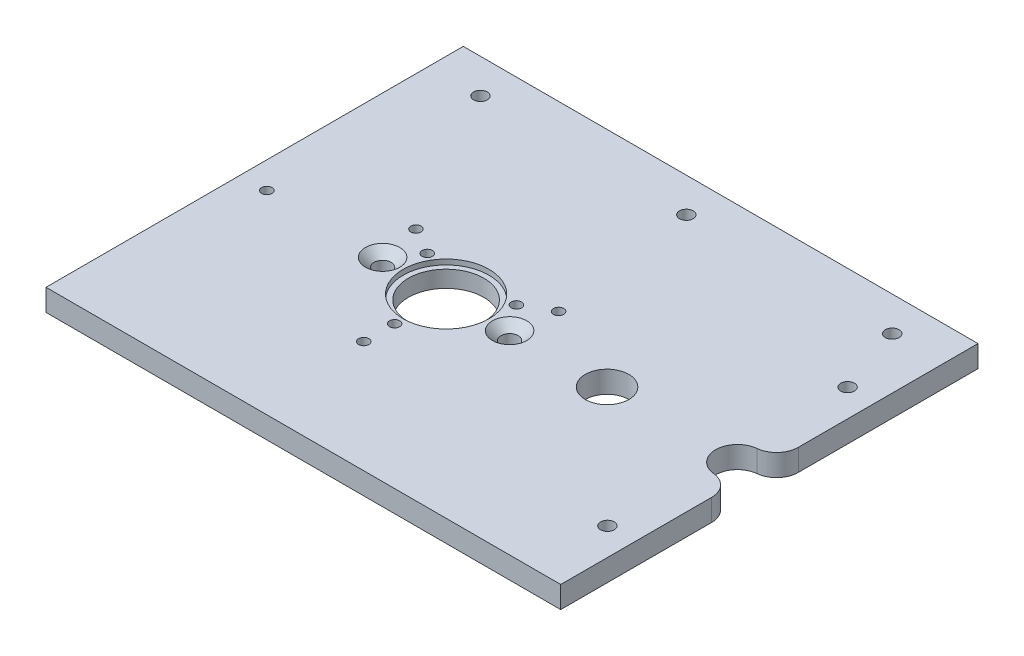
ISO-10303-21;
HEADER;
FILE_DESCRIPTION(('STEP AP214'),'2;1');
FILE_NAME('part.step','',(''),(''),'','','');
FILE_SCHEMA(('AUTOMOTIVE_DESIGN { 1 0 10303 214 1 1 1 1 }'));
ENDSEC;
DATA;
#1=APPLICATION_CONTEXT('core data for automotive mechanical design processes');
#2=APPLICATION_PROTOCOL_DEFINITION('international standard','automotive_design',2000,#1);
#3=PRODUCT_CONTEXT('',#1,'mechanical');
#4=PRODUCT('Part','Part','',(#3));
#5=PRODUCT_RELATED_PRODUCT_CATEGORY('part','',(#4));
#6=PRODUCT_DEFINITION_FORMATION('','',#4);
#7=PRODUCT_DEFINITION_CONTEXT('part definition',#1,'design');
#8=PRODUCT_DEFINITION('design','',#6,#7);
#9=PRODUCT_DEFINITION_SHAPE('','',#8);
#10=(LENGTH_UNIT() NAMED_UNIT(*) SI_UNIT(.MILLI.,.METRE.));
#11=(NAMED_UNIT(*) PLANE_ANGLE_UNIT() SI_UNIT($,.RADIAN.));
#12=(NAMED_UNIT(*) SI_UNIT($,.STERADIAN.) SOLID_ANGLE_UNIT());
#13=UNCERTAINTY_MEASURE_WITH_UNIT(LENGTH_MEASURE(1.E-05),#10,'distance_accuracy_value','');
#14=(GEOMETRIC_REPRESENTATION_CONTEXT(3) GLOBAL_UNCERTAINTY_ASSIGNED_CONTEXT((#13)) GLOBAL_UNIT_ASSIGNED_CONTEXT((#10,
#11,#12)) REPRESENTATION_CONTEXT('',''));
#15=CARTESIAN_POINT('',(0.,0.,0.));
#16=DIRECTION('',(0.,0.,1.));
#17=DIRECTION('',(1.,0.,0.));
#18=AXIS2_PLACEMENT_3D('',#15,#16,#17);
#19=CARTESIAN_POINT('',(-15.,-3.175,-5.80000000000001));
#20=DIRECTION('',(0.,1.,0.));
#21=DIRECTION('',(0.,0.,1.));
#22=AXIS2_PLACEMENT_3D('',#19,#20,#21);
#23=CYLINDRICAL_SURFACE('',#22,11.);
#24=CARTESIAN_POINT('',(-15.,-3.175,-5.80000000000001));
#25=DIRECTION('',(0.,1.,0.));
#26=DIRECTION('',(0.,0.,1.));
#27=AXIS2_PLACEMENT_3D('',#24,#25,#26);
#28=CIRCLE('',#27,11.);
#29=CARTESIAN_POINT('',(-15.,-3.175,5.19999999999999));
#30=VERTEX_POINT('',#29);
#31=EDGE_CURVE('E213',#30,#30,#28,.T.);
#32=ORIENTED_EDGE('',*,*,#31,.F.);
#33=EDGE_LOOP('',(#32));
#34=FACE_BOUND('',#33,.T.);
#35=CARTESIAN_POINT('',(-15.,1.675,-5.80000000000001));
#36=DIRECTION('',(0.,1.,0.));
#37=DIRECTION('',(0.,0.,1.));
#38=AXIS2_PLACEMENT_3D('',#35,#36,#37);
#39=CIRCLE('',#38,11.);
#40=CARTESIAN_POINT('',(-15.,1.675,5.19999999999999));
#41=VERTEX_POINT('',#40);
#42=EDGE_CURVE('E161',#41,#41,#39,.F.);
#43=ORIENTED_EDGE('',*,*,#42,.F.);
#44=EDGE_LOOP('',(#43));
#45=FACE_BOUND('',#44,.T.);
#46=ADVANCED_FACE('F41',(#34,#45),#23,.F.);
#47=CARTESIAN_POINT('',(75.,3.175,-50.8));
#48=DIRECTION('',(-1.,0.,0.));
#49=DIRECTION('',(0.,0.,1.));
#50=AXIS2_PLACEMENT_3D('',#47,#48,#49);
#51=PLANE('',#50);
#52=DIRECTION('',(0.,0.,-1.));
#53=VECTOR('',#52,1.);
#54=CARTESIAN_POINT('',(75.,-3.175,-50.8));
#55=LINE('',#54,#53);
#56=CARTESIAN_POINT('',(75.,-3.175,50.8));
#57=VERTEX_POINT('',#56);
#58=CARTESIAN_POINT('',(75.,-3.175,6.8383345421776));
#59=VERTEX_POINT('',#58);
#60=EDGE_CURVE('E234',#57,#59,#55,.T.);
#61=ORIENTED_EDGE('',*,*,#60,.T.);
#62=DIRECTION('',(0.,1.,0.));
#63=VECTOR('',#62,1.);
#64=CARTESIAN_POINT('',(75.,3.175,6.8383345421776));
#65=LINE('',#64,#63);
#66=CARTESIAN_POINT('',(75.,3.175,6.8383345421776));
#67=VERTEX_POINT('',#66);
#68=EDGE_CURVE('E247',#59,#67,#65,.T.);
#69=ORIENTED_EDGE('',*,*,#68,.T.);
#70=DIRECTION('',(0.,0.,-1.));
#71=VECTOR('',#70,1.);
#72=CARTESIAN_POINT('',(75.,3.175,-50.8));
#73=LINE('',#72,#71);
#74=CARTESIAN_POINT('',(75.,3.175,50.8));
#75=VERTEX_POINT('',#74);
#76=EDGE_CURVE('E121',#75,#67,#73,.T.);
#77=ORIENTED_EDGE('',*,*,#76,.F.);
#78=DIRECTION('',(0.,-1.,0.));
#79=VECTOR('',#78,1.);
#80=CARTESIAN_POINT('',(75.,3.175,50.8));
#81=LINE('',#80,#79);
#82=EDGE_CURVE('E233',#75,#57,#81,.T.);
#83=ORIENTED_EDGE('',*,*,#82,.T.);
#84=EDGE_LOOP('',(#61,#69,#77,#83));
#85=FACE_BOUND('',#84,.T.);
#86=ADVANCED_FACE('F353',(#85),#51,.F.);
#87=CARTESIAN_POINT('',(75.,3.175,-18.4383345421776));
#88=VERTEX_POINT('',#87);
#89=CARTESIAN_POINT('',(75.,3.175,-70.8));
#90=VERTEX_POINT('',#89);
#91=EDGE_CURVE('E110',#88,#90,#73,.T.);
#92=ORIENTED_EDGE('',*,*,#91,.F.);
#93=DIRECTION('',(0.,1.,0.));
#94=VECTOR('',#93,1.);
#95=CARTESIAN_POINT('',(75.,3.175,-18.4383345421776));
#96=LINE('',#95,#94);
#97=CARTESIAN_POINT('',(75.,-3.175,-18.4383345421776));
#98=VERTEX_POINT('',#97);
#99=EDGE_CURVE('E259',#88,#98,#96,.F.);
#100=ORIENTED_EDGE('',*,*,#99,.T.);
#101=CARTESIAN_POINT('',(75.,-3.17500000000001,-70.8));
#102=VERTEX_POINT('',#101);
#103=EDGE_CURVE('E128',#98,#102,#55,.T.);
#104=ORIENTED_EDGE('',*,*,#103,.T.);
#105=DIRECTION('',(0.,1.,0.));
#106=VECTOR('',#105,1.);
#107=CARTESIAN_POINT('',(75.,-154.502459504216,-70.8));
#108=LINE('',#107,#106);
#109=EDGE_CURVE('E125',#102,#90,#108,.T.);
#110=ORIENTED_EDGE('',*,*,#109,.T.);
#111=EDGE_LOOP('',(#92,#100,#104,#110));
#112=FACE_BOUND('',#111,.T.);
#113=ADVANCED_FACE('F126',(#112),#51,.F.);
#114=CARTESIAN_POINT('',(-75.,3.175,-50.8));
#115=DIRECTION('',(1.,0.,0.));
#116=DIRECTION('',(0.,0.,-1.));
#117=AXIS2_PLACEMENT_3D('',#114,#115,#116);
#118=PLANE('',#117);
#119=DIRECTION('',(0.,0.,1.));
#120=VECTOR('',#119,1.);
#121=CARTESIAN_POINT('',(-75.,-3.175,-50.8));
#122=LINE('',#121,#120);
#123=CARTESIAN_POINT('',(-75.,-3.17500000000001,-70.8));
#124=VERTEX_POINT('',#123);
#125=CARTESIAN_POINT('',(-75.,-3.175,50.8));
#126=VERTEX_POINT('',#125);
#127=EDGE_CURVE('E237',#124,#126,#122,.T.);
#128=ORIENTED_EDGE('',*,*,#127,.T.);
#129=DIRECTION('',(0.,-1.,0.));
#130=VECTOR('',#129,1.);
#131=CARTESIAN_POINT('',(-75.,3.175,50.8));
#132=LINE('',#131,#130);
#133=CARTESIAN_POINT('',(-75.,3.175,50.8));
#134=VERTEX_POINT('',#133);
#135=EDGE_CURVE('E242',#134,#126,#132,.T.);
#136=ORIENTED_EDGE('',*,*,#135,.F.);
#137=DIRECTION('',(0.,0.,1.));
#138=VECTOR('',#137,1.);
#139=CARTESIAN_POINT('',(-75.,3.175,-50.8));
#140=LINE('',#139,#138);
#141=CARTESIAN_POINT('',(-75.,3.175,-70.8));
#142=VERTEX_POINT('',#141);
#143=EDGE_CURVE('E229',#142,#134,#140,.T.);
#144=ORIENTED_EDGE('',*,*,#143,.F.);
#145=DIRECTION('',(0.,1.,0.));
#146=VECTOR('',#145,1.);
#147=CARTESIAN_POINT('',(-75.,-154.502459504216,-70.8));
#148=LINE('',#147,#146);
#149=EDGE_CURVE('E132',#124,#142,#148,.T.);
#150=ORIENTED_EDGE('',*,*,#149,.F.);
#151=EDGE_LOOP('',(#128,#136,#144,#150));
#152=FACE_BOUND('',#151,.T.);
#153=ADVANCED_FACE('F370',(#152),#118,.F.);
#154=CARTESIAN_POINT('',(-75.,3.175,50.8));
#155=DIRECTION('',(0.,0.,-1.));
#156=DIRECTION('',(-1.,0.,0.));
#157=AXIS2_PLACEMENT_3D('',#154,#155,#156);
#158=PLANE('',#157);
#159=DIRECTION('',(1.,0.,0.));
#160=VECTOR('',#159,1.);
#161=CARTESIAN_POINT('',(-75.,-3.175,50.8));
#162=LINE('',#161,#160);
#163=EDGE_CURVE('E122',#126,#57,#162,.T.);
#164=ORIENTED_EDGE('',*,*,#163,.T.);
#165=ORIENTED_EDGE('',*,*,#82,.F.);
#166=DIRECTION('',(1.,0.,0.));
#167=VECTOR('',#166,1.);
#168=CARTESIAN_POINT('',(-75.,3.175,50.8));
#169=LINE('',#168,#167);
#170=EDGE_CURVE('E231',#134,#75,#169,.T.);
#171=ORIENTED_EDGE('',*,*,#170,.F.);
#172=ORIENTED_EDGE('',*,*,#135,.T.);
#173=EDGE_LOOP('',(#164,#165,#171,#172));
#174=FACE_BOUND('',#173,.T.);
#175=ADVANCED_FACE('F337',(#174),#158,.F.);
#176=CARTESIAN_POINT('',(0.,3.175,0.));
#177=DIRECTION('',(0.,1.,0.));
#178=DIRECTION('',(0.,0.,1.));
#179=AXIS2_PLACEMENT_3D('',#176,#177,#178);
#180=PLANE('',#179);
#181=CARTESIAN_POINT('',(-33.5,3.175,-5.80000000000001));
#182=DIRECTION('',(0.,1.,0.));
#183=DIRECTION('',(0.,0.,1.));
#184=AXIS2_PLACEMENT_3D('',#181,#182,#183);
#185=CIRCLE('',#184,5.);
#186=CARTESIAN_POINT('',(-33.5,3.175,-0.800000000000009));
#187=VERTEX_POINT('',#186);
#188=EDGE_CURVE('E50',#187,#187,#185,.F.);
#189=ORIENTED_EDGE('',*,*,#188,.T.);
#190=EDGE_LOOP('',(#189));
#191=FACE_BOUND('',#190,.T.);
#192=CARTESIAN_POINT('',(3.5,3.175,-5.80000000000001));
#193=DIRECTION('',(0.,1.,0.));
#194=DIRECTION('',(0.,0.,1.));
#195=AXIS2_PLACEMENT_3D('',#192,#193,#194);
#196=CIRCLE('',#195,5.);
#197=CARTESIAN_POINT('',(3.5,3.175,-0.800000000000009));
#198=VERTEX_POINT('',#197);
#199=EDGE_CURVE('E266',#198,#198,#196,.F.);
#200=ORIENTED_EDGE('',*,*,#199,.T.);
#201=EDGE_LOOP('',(#200));
#202=FACE_BOUND('',#201,.T.);
#203=CARTESIAN_POINT('',(-15.,3.175,-5.80000000000001));
#204=DIRECTION('',(0.,1.,0.));
#205=DIRECTION('',(0.,0.,1.));
#206=AXIS2_PLACEMENT_3D('',#203,#204,#205);
#207=CIRCLE('',#206,12.5);
#208=CARTESIAN_POINT('',(-15.,3.175,6.69999999999999));
#209=VERTEX_POINT('',#208);
#210=EDGE_CURVE('E154',#209,#209,#207,.T.);
#211=ORIENTED_EDGE('',*,*,#210,.F.);
#212=EDGE_LOOP('',(#211));
#213=FACE_BOUND('',#212,.T.);
#214=CARTESIAN_POINT('',(5.78460969082654,3.175,-17.8));
#215=DIRECTION('',(0.,1.,0.));
#216=DIRECTION('',(0.,0.,1.));
#217=AXIS2_PLACEMENT_3D('',#214,#215,#216);
#218=CIRCLE('',#217,1.5);
#219=CARTESIAN_POINT('',(5.78460969082654,3.175,-16.3));
#220=VERTEX_POINT('',#219);
#221=EDGE_CURVE('E177',#220,#220,#218,.T.);
#222=ORIENTED_EDGE('',*,*,#221,.F.);
#223=EDGE_LOOP('',(#222));
#224=FACE_BOUND('',#223,.T.);
#225=CARTESIAN_POINT('',(-15.,3.175,18.2));
#226=DIRECTION('',(0.,1.,0.));
#227=DIRECTION('',(0.,0.,1.));
#228=AXIS2_PLACEMENT_3D('',#225,#226,#227);
#229=CIRCLE('',#228,1.5);
#230=CARTESIAN_POINT('',(-15.,3.175,19.7));
#231=VERTEX_POINT('',#230);
#232=EDGE_CURVE('E178',#231,#231,#229,.T.);
#233=ORIENTED_EDGE('',*,*,#232,.F.);
#234=EDGE_LOOP('',(#233));
#235=FACE_BOUND('',#234,.T.);
#236=CARTESIAN_POINT('',(-27.9903810567666,3.175,-13.3));
#237=DIRECTION('',(0.,1.,0.));
#238=DIRECTION('',(0.,0.,1.));
#239=AXIS2_PLACEMENT_3D('',#236,#237,#238);
#240=CIRCLE('',#239,1.5);
#241=CARTESIAN_POINT('',(-27.9903810567666,3.175,-11.8));
#242=VERTEX_POINT('',#241);
#243=EDGE_CURVE('E185',#242,#242,#240,.T.);
#244=ORIENTED_EDGE('',*,*,#243,.F.);
#245=EDGE_LOOP('',(#244));
#246=FACE_BOUND('',#245,.T.);
#247=CARTESIAN_POINT('',(-35.7846096908265,3.175,-17.8));
#248=DIRECTION('',(0.,1.,0.));
#249=DIRECTION('',(0.,0.,1.));
#250=AXIS2_PLACEMENT_3D('',#247,#248,#249);
#251=CIRCLE('',#250,1.5);
#252=CARTESIAN_POINT('',(-35.7846096908265,3.175,-16.3));
#253=VERTEX_POINT('',#252);
#254=EDGE_CURVE('E164',#253,#253,#251,.T.);
#255=ORIENTED_EDGE('',*,*,#254,.F.);
#256=EDGE_LOOP('',(#255));
#257=FACE_BOUND('',#256,.T.);
#258=CARTESIAN_POINT('',(-2.00961894323341,3.175,-13.3));
#259=DIRECTION('',(0.,1.,0.));
#260=DIRECTION('',(0.,0.,1.));
#261=AXIS2_PLACEMENT_3D('',#258,#259,#260);
#262=CIRCLE('',#261,1.5);
#263=CARTESIAN_POINT('',(-2.00961894323341,3.175,-11.8));
#264=VERTEX_POINT('',#263);
#265=EDGE_CURVE('E171',#264,#264,#262,.T.);
#266=ORIENTED_EDGE('',*,*,#265,.F.);
#267=EDGE_LOOP('',(#266));
#268=FACE_BOUND('',#267,.T.);
#269=CARTESIAN_POINT('',(-15.,3.175,9.19999999999999));
#270=DIRECTION('',(0.,1.,0.));
#271=DIRECTION('',(0.,0.,1.));
#272=AXIS2_PLACEMENT_3D('',#269,#270,#271);
#273=CIRCLE('',#272,1.5);
#274=CARTESIAN_POINT('',(-15.,3.175,10.7));
#275=VERTEX_POINT('',#274);
#276=EDGE_CURVE('E181',#275,#275,#273,.T.);
#277=ORIENTED_EDGE('',*,*,#276,.F.);
#278=EDGE_LOOP('',(#277));
#279=FACE_BOUND('',#278,.T.);
#280=CARTESIAN_POINT('',(67.,3.175,-40.8));
#281=DIRECTION('',(0.,1.,0.));
#282=DIRECTION('',(0.,0.,1.));
#283=AXIS2_PLACEMENT_3D('',#280,#281,#282);
#284=CIRCLE('',#283,2.);
#285=CARTESIAN_POINT('',(67.,3.175,-38.8));
#286=VERTEX_POINT('',#285);
#287=EDGE_CURVE('E204',#286,#286,#284,.T.);
#288=ORIENTED_EDGE('',*,*,#287,.F.);
#289=EDGE_LOOP('',(#288));
#290=FACE_BOUND('',#289,.T.);
#291=ORIENTED_EDGE('',*,*,#76,.T.);
#292=CARTESIAN_POINT('',(68.65,3.175,6.8383345421776));
#293=DIRECTION('',(0.,1.,0.));
#294=DIRECTION('',(0.,0.,1.));
#295=AXIS2_PLACEMENT_3D('',#292,#293,#294);
#296=CIRCLE('',#295,6.35);
#297=CARTESIAN_POINT('',(69.275,3.175,0.519167271088791));
#298=VERTEX_POINT('',#297);
#299=EDGE_CURVE('E251',#67,#298,#296,.T.);
#300=ORIENTED_EDGE('',*,*,#299,.T.);
#301=CARTESIAN_POINT('',(69.9,3.175,-5.80000000000001));
#302=DIRECTION('',(0.,1.,0.));
#303=DIRECTION('',(0.,0.,1.));
#304=AXIS2_PLACEMENT_3D('',#301,#302,#303);
#305=CIRCLE('',#304,6.35);
#306=CARTESIAN_POINT('',(69.275,3.175,-12.1191672710888));
#307=VERTEX_POINT('',#306);
#308=EDGE_CURVE('E198',#307,#298,#305,.T.);
#309=ORIENTED_EDGE('',*,*,#308,.F.);
#310=CARTESIAN_POINT('',(68.65,3.175,-18.4383345421776));
#311=DIRECTION('',(0.,1.,0.));
#312=DIRECTION('',(0.,0.,1.));
#313=AXIS2_PLACEMENT_3D('',#310,#311,#312);
#314=CIRCLE('',#313,6.35);
#315=EDGE_CURVE('E119',#307,#88,#314,.T.);
#316=ORIENTED_EDGE('',*,*,#315,.T.);
#317=ORIENTED_EDGE('',*,*,#91,.T.);
#318=DIRECTION('',(-1.,0.,0.));
#319=VECTOR('',#318,1.);
#320=CARTESIAN_POINT('',(-75.,3.175,-70.8));
#321=LINE('',#320,#319);
#322=EDGE_CURVE('E116',#90,#142,#321,.T.);
#323=ORIENTED_EDGE('',*,*,#322,.T.);
#324=ORIENTED_EDGE('',*,*,#143,.T.);
#325=ORIENTED_EDGE('',*,*,#170,.T.);
#326=EDGE_LOOP('',(#291,#300,#309,#316,#317,#323,#324,#325));
#327=FACE_BOUND('',#326,.T.);
#328=CARTESIAN_POINT('',(67.,3.175,29.2));
#329=DIRECTION('',(0.,1.,0.));
#330=DIRECTION('',(0.,0.,-1.));
#331=AXIS2_PLACEMENT_3D('',#328,#329,#330);
#332=CIRCLE('',#331,2.);
#333=CARTESIAN_POINT('',(67.,3.175,27.2));
#334=VERTEX_POINT('',#333);
#335=EDGE_CURVE('E207',#334,#334,#332,.T.);
#336=ORIENTED_EDGE('',*,*,#335,.F.);
#337=EDGE_LOOP('',(#336));
#338=FACE_BOUND('',#337,.T.);
#339=CARTESIAN_POINT('',(-67.25,3.175,-5.80000000000001));
#340=DIRECTION('',(0.,1.,0.));
#341=DIRECTION('',(0.,0.,1.));
#342=AXIS2_PLACEMENT_3D('',#339,#340,#341);
#343=CIRCLE('',#342,1.5);
#344=CARTESIAN_POINT('',(-67.25,3.175,-4.30000000000002));
#345=VERTEX_POINT('',#344);
#346=EDGE_CURVE('E210',#345,#345,#343,.T.);
#347=ORIENTED_EDGE('',*,*,#346,.F.);
#348=EDGE_LOOP('',(#347));
#349=FACE_BOUND('',#348,.T.);
#350=CARTESIAN_POINT('',(31.9,3.175,-5.80000000000001));
#351=DIRECTION('',(0.,1.,0.));
#352=DIRECTION('',(0.,0.,1.));
#353=AXIS2_PLACEMENT_3D('',#350,#351,#352);
#354=CIRCLE('',#353,6.35);
#355=CARTESIAN_POINT('',(31.9,3.175,0.549999999999989));
#356=VERTEX_POINT('',#355);
#357=EDGE_CURVE('E217',#356,#356,#354,.T.);
#358=ORIENTED_EDGE('',*,*,#357,.F.);
#359=EDGE_LOOP('',(#358));
#360=FACE_BOUND('',#359,.T.);
#361=CARTESIAN_POINT('',(60.,3.175,-60.8000000000002));
#362=DIRECTION('',(0.,1.,0.));
#363=DIRECTION('',(0.,0.,-1.));
#364=AXIS2_PLACEMENT_3D('',#361,#362,#363);
#365=CIRCLE('',#364,2.);
#366=CARTESIAN_POINT('',(60.,3.175,-62.8000000000002));
#367=VERTEX_POINT('',#366);
#368=EDGE_CURVE('E328',#367,#367,#365,.T.);
#369=ORIENTED_EDGE('',*,*,#368,.F.);
#370=EDGE_LOOP('',(#369));
#371=FACE_BOUND('',#370,.T.);
#372=CARTESIAN_POINT('',(-60.,3.175,-60.8));
#373=DIRECTION('',(0.,1.,0.));
#374=DIRECTION('',(0.,0.,1.));
#375=AXIS2_PLACEMENT_3D('',#372,#373,#374);
#376=CIRCLE('',#375,2.);
#377=CARTESIAN_POINT('',(-60.,3.175,-58.8));
#378=VERTEX_POINT('',#377);
#379=EDGE_CURVE('E140',#378,#378,#376,.T.);
#380=ORIENTED_EDGE('',*,*,#379,.F.);
#381=EDGE_LOOP('',(#380));
#382=FACE_BOUND('',#381,.T.);
#383=CARTESIAN_POINT('',(0.,3.175,-60.8));
#384=DIRECTION('',(0.,1.,0.));
#385=DIRECTION('',(0.,0.,1.));
#386=AXIS2_PLACEMENT_3D('',#383,#384,#385);
#387=CIRCLE('',#386,2.);
#388=CARTESIAN_POINT('',(0.,3.175,-58.8));
#389=VERTEX_POINT('',#388);
#390=EDGE_CURVE('E137',#389,#389,#387,.T.);
#391=ORIENTED_EDGE('',*,*,#390,.F.);
#392=EDGE_LOOP('',(#391));
#393=FACE_BOUND('',#392,.T.);
#394=ADVANCED_FACE('F113',(#191,#202,#213,#224,#235,#246,#257,#268,#279,#290,#327,#338,#349,
#360,#371,#382,#393),#180,.T.);
#395=CARTESIAN_POINT('',(0.,-3.175,0.));
#396=DIRECTION('',(0.,1.,0.));
#397=DIRECTION('',(0.,0.,1.));
#398=AXIS2_PLACEMENT_3D('',#395,#396,#397);
#399=PLANE('',#398);
#400=CARTESIAN_POINT('',(3.5,-3.175,-5.80000000000001));
#401=DIRECTION('',(0.,1.,0.));
#402=DIRECTION('',(0.,0.,1.));
#403=AXIS2_PLACEMENT_3D('',#400,#401,#402);
#404=CIRCLE('',#403,2.5);
#405=CARTESIAN_POINT('',(3.5,-3.175,-3.30000000000001));
#406=VERTEX_POINT('',#405);
#407=EDGE_CURVE('E151',#406,#406,#404,.T.);
#408=ORIENTED_EDGE('',*,*,#407,.T.);
#409=EDGE_LOOP('',(#408));
#410=FACE_BOUND('',#409,.T.);
#411=CARTESIAN_POINT('',(-33.5,-3.175,-5.80000000000001));
#412=DIRECTION('',(0.,1.,0.));
#413=DIRECTION('',(0.,0.,-1.));
#414=AXIS2_PLACEMENT_3D('',#411,#412,#413);
#415=CIRCLE('',#414,2.5);
#416=CARTESIAN_POINT('',(-33.5,-3.175,-8.30000000000001));
#417=VERTEX_POINT('',#416);
#418=EDGE_CURVE('E155',#417,#417,#415,.T.);
#419=ORIENTED_EDGE('',*,*,#418,.T.);
#420=EDGE_LOOP('',(#419));
#421=FACE_BOUND('',#420,.T.);
#422=CARTESIAN_POINT('',(5.78460969082654,-3.175,-17.8));
#423=DIRECTION('',(0.,1.,0.));
#424=DIRECTION('',(0.,0.,1.));
#425=AXIS2_PLACEMENT_3D('',#422,#423,#424);
#426=CIRCLE('',#425,1.5);
#427=CARTESIAN_POINT('',(5.78460969082654,-3.175,-16.3));
#428=VERTEX_POINT('',#427);
#429=EDGE_CURVE('E192',#428,#428,#426,.T.);
#430=ORIENTED_EDGE('',*,*,#429,.T.);
#431=EDGE_LOOP('',(#430));
#432=FACE_BOUND('',#431,.T.);
#433=CARTESIAN_POINT('',(-15.,-3.175,18.2));
#434=DIRECTION('',(0.,1.,0.));
#435=DIRECTION('',(0.,0.,1.));
#436=AXIS2_PLACEMENT_3D('',#433,#434,#435);
#437=CIRCLE('',#436,1.5);
#438=CARTESIAN_POINT('',(-15.,-3.175,19.7));
#439=VERTEX_POINT('',#438);
#440=EDGE_CURVE('E182',#439,#439,#437,.T.);
#441=ORIENTED_EDGE('',*,*,#440,.T.);
#442=EDGE_LOOP('',(#441));
#443=FACE_BOUND('',#442,.T.);
#444=CARTESIAN_POINT('',(-27.9903810567666,-3.175,-13.3));
#445=DIRECTION('',(0.,1.,0.));
#446=DIRECTION('',(0.,0.,1.));
#447=AXIS2_PLACEMENT_3D('',#444,#445,#446);
#448=CIRCLE('',#447,1.5);
#449=CARTESIAN_POINT('',(-27.9903810567666,-3.175,-11.8));
#450=VERTEX_POINT('',#449);
#451=EDGE_CURVE('E167',#450,#450,#448,.T.);
#452=ORIENTED_EDGE('',*,*,#451,.T.);
#453=EDGE_LOOP('',(#452));
#454=FACE_BOUND('',#453,.T.);
#455=CARTESIAN_POINT('',(-35.7846096908265,-3.175,-17.8));
#456=DIRECTION('',(0.,1.,0.));
#457=DIRECTION('',(0.,0.,1.));
#458=AXIS2_PLACEMENT_3D('',#455,#456,#457);
#459=CIRCLE('',#458,1.5);
#460=CARTESIAN_POINT('',(-35.7846096908265,-3.175,-16.3));
#461=VERTEX_POINT('',#460);
#462=EDGE_CURVE('E168',#461,#461,#459,.T.);
#463=ORIENTED_EDGE('',*,*,#462,.T.);
#464=EDGE_LOOP('',(#463));
#465=FACE_BOUND('',#464,.T.);
#466=CARTESIAN_POINT('',(-2.00961894323341,-3.175,-13.3));
#467=DIRECTION('',(0.,1.,0.));
#468=DIRECTION('',(0.,0.,1.));
#469=AXIS2_PLACEMENT_3D('',#466,#467,#468);
#470=CIRCLE('',#469,1.5);
#471=CARTESIAN_POINT('',(-2.00961894323341,-3.175,-11.8));
#472=VERTEX_POINT('',#471);
#473=EDGE_CURVE('E174',#472,#472,#470,.T.);
#474=ORIENTED_EDGE('',*,*,#473,.T.);
#475=EDGE_LOOP('',(#474));
#476=FACE_BOUND('',#475,.T.);
#477=CARTESIAN_POINT('',(-15.,-3.175,9.19999999999999));
#478=DIRECTION('',(0.,1.,0.));
#479=DIRECTION('',(0.,0.,1.));
#480=AXIS2_PLACEMENT_3D('',#477,#478,#479);
#481=CIRCLE('',#480,1.5);
#482=CARTESIAN_POINT('',(-15.,-3.175,10.7));
#483=VERTEX_POINT('',#482);
#484=EDGE_CURVE('E195',#483,#483,#481,.T.);
#485=ORIENTED_EDGE('',*,*,#484,.T.);
#486=EDGE_LOOP('',(#485));
#487=FACE_BOUND('',#486,.T.);
#488=CARTESIAN_POINT('',(67.,-3.175,-40.8));
#489=DIRECTION('',(0.,1.,0.));
#490=DIRECTION('',(0.,0.,1.));
#491=AXIS2_PLACEMENT_3D('',#488,#489,#490);
#492=CIRCLE('',#491,2.);
#493=CARTESIAN_POINT('',(67.,-3.175,-38.8));
#494=VERTEX_POINT('',#493);
#495=EDGE_CURVE('E201',#494,#494,#492,.T.);
#496=ORIENTED_EDGE('',*,*,#495,.T.);
#497=EDGE_LOOP('',(#496));
#498=FACE_BOUND('',#497,.T.);
#499=CARTESIAN_POINT('',(67.,-3.175,29.2));
#500=DIRECTION('',(0.,1.,0.));
#501=DIRECTION('',(0.,0.,-1.));
#502=AXIS2_PLACEMENT_3D('',#499,#500,#501);
#503=CIRCLE('',#502,2.);
#504=CARTESIAN_POINT('',(67.,-3.175,27.2));
#505=VERTEX_POINT('',#504);
#506=EDGE_CURVE('E224',#505,#505,#503,.T.);
#507=ORIENTED_EDGE('',*,*,#506,.T.);
#508=EDGE_LOOP('',(#507));
#509=FACE_BOUND('',#508,.T.);
#510=ORIENTED_EDGE('',*,*,#31,.T.);
#511=EDGE_LOOP('',(#510));
#512=FACE_BOUND('',#511,.T.);
#513=CARTESIAN_POINT('',(-67.25,-3.175,-5.80000000000001));
#514=DIRECTION('',(0.,1.,0.));
#515=DIRECTION('',(0.,0.,1.));
#516=AXIS2_PLACEMENT_3D('',#513,#514,#515);
#517=CIRCLE('',#516,1.5);
#518=CARTESIAN_POINT('',(-67.25,-3.175,-4.30000000000002));
#519=VERTEX_POINT('',#518);
#520=EDGE_CURVE('E214',#519,#519,#517,.T.);
#521=ORIENTED_EDGE('',*,*,#520,.T.);
#522=EDGE_LOOP('',(#521));
#523=FACE_BOUND('',#522,.T.);
#524=CARTESIAN_POINT('',(31.9,-3.175,-5.80000000000001));
#525=DIRECTION('',(0.,1.,0.));
#526=DIRECTION('',(0.,0.,1.));
#527=AXIS2_PLACEMENT_3D('',#524,#525,#526);
#528=CIRCLE('',#527,6.35);
#529=CARTESIAN_POINT('',(31.9,-3.175,0.549999999999989));
#530=VERTEX_POINT('',#529);
#531=EDGE_CURVE('E209',#530,#530,#528,.T.);
#532=ORIENTED_EDGE('',*,*,#531,.T.);
#533=EDGE_LOOP('',(#532));
#534=FACE_BOUND('',#533,.T.);
#535=CARTESIAN_POINT('',(69.9,-3.175,-5.80000000000001));
#536=DIRECTION('',(0.,1.,0.));
#537=DIRECTION('',(0.,0.,1.));
#538=AXIS2_PLACEMENT_3D('',#535,#536,#537);
#539=CIRCLE('',#538,6.35);
#540=CARTESIAN_POINT('',(69.275,-3.175,-12.1191672710888));
#541=VERTEX_POINT('',#540);
#542=CARTESIAN_POINT('',(69.275,-3.175,0.519167271088791));
#543=VERTEX_POINT('',#542);
#544=EDGE_CURVE('E245',#541,#543,#539,.T.);
#545=ORIENTED_EDGE('',*,*,#544,.T.);
#546=CARTESIAN_POINT('',(68.65,-3.175,6.8383345421776));
#547=DIRECTION('',(0.,1.,0.));
#548=DIRECTION('',(0.,0.,1.));
#549=AXIS2_PLACEMENT_3D('',#546,#547,#548);
#550=CIRCLE('',#549,6.35);
#551=EDGE_CURVE('E257',#543,#59,#550,.F.);
#552=ORIENTED_EDGE('',*,*,#551,.T.);
#553=ORIENTED_EDGE('',*,*,#60,.F.);
#554=ORIENTED_EDGE('',*,*,#163,.F.);
#555=ORIENTED_EDGE('',*,*,#127,.F.);
#556=DIRECTION('',(1.,0.,0.));
#557=VECTOR('',#556,1.);
#558=CARTESIAN_POINT('',(-75.,-3.17500000000001,-70.8));
#559=LINE('',#558,#557);
#560=EDGE_CURVE('E144',#124,#102,#559,.T.);
#561=ORIENTED_EDGE('',*,*,#560,.T.);
#562=ORIENTED_EDGE('',*,*,#103,.F.);
#563=CARTESIAN_POINT('',(68.65,-3.175,-18.4383345421776));
#564=DIRECTION('',(0.,1.,0.));
#565=DIRECTION('',(0.,0.,1.));
#566=AXIS2_PLACEMENT_3D('',#563,#564,#565);
#567=CIRCLE('',#566,6.35);
#568=EDGE_CURVE('E57',#98,#541,#567,.F.);
#569=ORIENTED_EDGE('',*,*,#568,.T.);
#570=EDGE_LOOP('',(#545,#552,#553,#554,#555,#561,#562,#569));
#571=FACE_BOUND('',#570,.T.);
#572=CARTESIAN_POINT('',(-60.,-3.17500000000001,-60.8));
#573=DIRECTION('',(0.,1.,0.));
#574=DIRECTION('',(0.,0.,1.));
#575=AXIS2_PLACEMENT_3D('',#572,#573,#574);
#576=CIRCLE('',#575,2.);
#577=CARTESIAN_POINT('',(-60.,-3.17500000000001,-58.8));
#578=VERTEX_POINT('',#577);
#579=EDGE_CURVE('E150',#578,#578,#576,.F.);
#580=ORIENTED_EDGE('',*,*,#579,.F.);
#581=EDGE_LOOP('',(#580));
#582=FACE_BOUND('',#581,.T.);
#583=CARTESIAN_POINT('',(60.,-3.17500000000001,-60.8000000000002));
#584=DIRECTION('',(0.,1.,0.));
#585=DIRECTION('',(0.,0.,1.));
#586=AXIS2_PLACEMENT_3D('',#583,#584,#585);
#587=CIRCLE('',#586,2.);
#588=CARTESIAN_POINT('',(60.,-3.17500000000001,-58.8000000000002));
#589=VERTEX_POINT('',#588);
#590=EDGE_CURVE('E146',#589,#589,#587,.F.);
#591=ORIENTED_EDGE('',*,*,#590,.F.);
#592=EDGE_LOOP('',(#591));
#593=FACE_BOUND('',#592,.T.);
#594=CARTESIAN_POINT('',(0.,-3.17500000000001,-60.8));
#595=DIRECTION('',(0.,1.,0.));
#596=DIRECTION('',(0.,0.,1.));
#597=AXIS2_PLACEMENT_3D('',#594,#595,#596);
#598=CIRCLE('',#597,2.);
#599=CARTESIAN_POINT('',(0.,-3.17500000000001,-58.8));
#600=VERTEX_POINT('',#599);
#601=EDGE_CURVE('E149',#600,#600,#598,.F.);
#602=ORIENTED_EDGE('',*,*,#601,.F.);
#603=EDGE_LOOP('',(#602));
#604=FACE_BOUND('',#603,.T.);
#605=ADVANCED_FACE('F286',(#410,#421,#432,#443,#454,#465,#476,#487,#498,#509,#512,#523,#534,
#571,#582,#593,#604),#399,.F.);
#606=CARTESIAN_POINT('',(31.9,-3.175,-5.80000000000001));
#607=DIRECTION('',(0.,1.,0.));
#608=DIRECTION('',(0.,0.,1.));
#609=AXIS2_PLACEMENT_3D('',#606,#607,#608);
#610=CYLINDRICAL_SURFACE('',#609,6.35);
#611=ORIENTED_EDGE('',*,*,#531,.F.);
#612=EDGE_LOOP('',(#611));
#613=FACE_BOUND('',#612,.T.);
#614=ORIENTED_EDGE('',*,*,#357,.T.);
#615=EDGE_LOOP('',(#614));
#616=FACE_BOUND('',#615,.T.);
#617=ADVANCED_FACE('F289',(#613,#616),#610,.F.);
#618=CARTESIAN_POINT('',(-67.25,-3.175,-5.80000000000001));
#619=DIRECTION('',(0.,1.,0.));
#620=DIRECTION('',(0.,0.,1.));
#621=AXIS2_PLACEMENT_3D('',#618,#619,#620);
#622=CYLINDRICAL_SURFACE('',#621,1.5);
#623=ORIENTED_EDGE('',*,*,#520,.F.);
#624=EDGE_LOOP('',(#623));
#625=FACE_BOUND('',#624,.T.);
#626=ORIENTED_EDGE('',*,*,#346,.T.);
#627=EDGE_LOOP('',(#626));
#628=FACE_BOUND('',#627,.T.);
#629=ADVANCED_FACE('F411',(#625,#628),#622,.F.);
#630=CARTESIAN_POINT('',(67.,-3.175,29.2));
#631=DIRECTION('',(0.,1.,0.));
#632=DIRECTION('',(0.,0.,1.));
#633=AXIS2_PLACEMENT_3D('',#630,#631,#632);
#634=CYLINDRICAL_SURFACE('',#633,2.);
#635=ORIENTED_EDGE('',*,*,#506,.F.);
#636=EDGE_LOOP('',(#635));
#637=FACE_BOUND('',#636,.T.);
#638=ORIENTED_EDGE('',*,*,#335,.T.);
#639=EDGE_LOOP('',(#638));
#640=FACE_BOUND('',#639,.T.);
#641=ADVANCED_FACE('F365',(#637,#640),#634,.F.);
#642=CARTESIAN_POINT('',(69.9,-3.175,-5.80000000000001));
#643=DIRECTION('',(0.,1.,0.));
#644=DIRECTION('',(0.,0.,1.));
#645=AXIS2_PLACEMENT_3D('',#642,#643,#644);
#646=CYLINDRICAL_SURFACE('',#645,6.35);
#647=ORIENTED_EDGE('',*,*,#308,.T.);
#648=DIRECTION('',(0.,1.,0.));
#649=VECTOR('',#648,1.);
#650=CARTESIAN_POINT('',(69.275,-3.175,0.519167271088791));
#651=LINE('',#650,#649);
#652=EDGE_CURVE('E65',#298,#543,#651,.F.);
#653=ORIENTED_EDGE('',*,*,#652,.T.);
#654=ORIENTED_EDGE('',*,*,#544,.F.);
#655=DIRECTION('',(0.,1.,0.));
#656=VECTOR('',#655,1.);
#657=CARTESIAN_POINT('',(69.275,-3.175,-12.1191672710888));
#658=LINE('',#657,#656);
#659=EDGE_CURVE('E253',#541,#307,#658,.T.);
#660=ORIENTED_EDGE('',*,*,#659,.T.);
#661=EDGE_LOOP('',(#647,#653,#654,#660));
#662=FACE_BOUND('',#661,.T.);
#663=ADVANCED_FACE('F402',(#662),#646,.F.);
#664=CARTESIAN_POINT('',(67.,-3.175,-40.8));
#665=DIRECTION('',(0.,1.,0.));
#666=DIRECTION('',(0.,0.,1.));
#667=AXIS2_PLACEMENT_3D('',#664,#665,#666);
#668=CYLINDRICAL_SURFACE('',#667,2.);
#669=ORIENTED_EDGE('',*,*,#495,.F.);
#670=EDGE_LOOP('',(#669));
#671=FACE_BOUND('',#670,.T.);
#672=ORIENTED_EDGE('',*,*,#287,.T.);
#673=EDGE_LOOP('',(#672));
#674=FACE_BOUND('',#673,.T.);
#675=ADVANCED_FACE('F380',(#671,#674),#668,.F.);
#676=CARTESIAN_POINT('',(68.65,-3.175,6.8383345421776));
#677=DIRECTION('',(0.,1.,0.));
#678=DIRECTION('',(0.,0.,1.));
#679=AXIS2_PLACEMENT_3D('',#676,#677,#678);
#680=CYLINDRICAL_SURFACE('',#679,6.35);
#681=ORIENTED_EDGE('',*,*,#551,.F.);
#682=ORIENTED_EDGE('',*,*,#652,.F.);
#683=ORIENTED_EDGE('',*,*,#299,.F.);
#684=ORIENTED_EDGE('',*,*,#68,.F.);
#685=EDGE_LOOP('',(#681,#682,#683,#684));
#686=FACE_BOUND('',#685,.T.);
#687=ADVANCED_FACE('F376',(#686),#680,.T.);
#688=CARTESIAN_POINT('',(68.65,-3.175,-18.4383345421776));
#689=DIRECTION('',(0.,1.,0.));
#690=DIRECTION('',(0.,0.,1.));
#691=AXIS2_PLACEMENT_3D('',#688,#689,#690);
#692=CYLINDRICAL_SURFACE('',#691,6.35);
#693=ORIENTED_EDGE('',*,*,#315,.F.);
#694=ORIENTED_EDGE('',*,*,#659,.F.);
#695=ORIENTED_EDGE('',*,*,#568,.F.);
#696=ORIENTED_EDGE('',*,*,#99,.F.);
#697=EDGE_LOOP('',(#693,#694,#695,#696));
#698=FACE_BOUND('',#697,.T.);
#699=ADVANCED_FACE('F379',(#698),#692,.T.);
#700=CARTESIAN_POINT('',(-15.,-3.175,9.19999999999999));
#701=DIRECTION('',(0.,1.,0.));
#702=DIRECTION('',(0.,0.,1.));
#703=AXIS2_PLACEMENT_3D('',#700,#701,#702);
#704=CYLINDRICAL_SURFACE('',#703,1.5);
#705=ORIENTED_EDGE('',*,*,#484,.F.);
#706=EDGE_LOOP('',(#705));
#707=FACE_BOUND('',#706,.T.);
#708=ORIENTED_EDGE('',*,*,#276,.T.);
#709=EDGE_LOOP('',(#708));
#710=FACE_BOUND('',#709,.T.);
#711=ADVANCED_FACE('F383',(#707,#710),#704,.F.);
#712=CARTESIAN_POINT('',(-2.00961894323341,-3.175,-13.3));
#713=DIRECTION('',(0.,1.,0.));
#714=DIRECTION('',(0.,0.,1.));
#715=AXIS2_PLACEMENT_3D('',#712,#713,#714);
#716=CYLINDRICAL_SURFACE('',#715,1.5);
#717=ORIENTED_EDGE('',*,*,#473,.F.);
#718=EDGE_LOOP('',(#717));
#719=FACE_BOUND('',#718,.T.);
#720=ORIENTED_EDGE('',*,*,#265,.T.);
#721=EDGE_LOOP('',(#720));
#722=FACE_BOUND('',#721,.T.);
#723=ADVANCED_FACE('F392',(#719,#722),#716,.F.);
#724=CARTESIAN_POINT('',(-35.7846096908265,-3.175,-17.8));
#725=DIRECTION('',(0.,1.,0.));
#726=DIRECTION('',(0.,0.,1.));
#727=AXIS2_PLACEMENT_3D('',#724,#725,#726);
#728=CYLINDRICAL_SURFACE('',#727,1.5);
#729=ORIENTED_EDGE('',*,*,#462,.F.);
#730=EDGE_LOOP('',(#729));
#731=FACE_BOUND('',#730,.T.);
#732=ORIENTED_EDGE('',*,*,#254,.T.);
#733=EDGE_LOOP('',(#732));
#734=FACE_BOUND('',#733,.T.);
#735=ADVANCED_FACE('F561',(#731,#734),#728,.F.);
#736=CARTESIAN_POINT('',(-27.9903810567666,-3.175,-13.3));
#737=DIRECTION('',(0.,1.,0.));
#738=DIRECTION('',(0.,0.,1.));
#739=AXIS2_PLACEMENT_3D('',#736,#737,#738);
#740=CYLINDRICAL_SURFACE('',#739,1.5);
#741=ORIENTED_EDGE('',*,*,#451,.F.);
#742=EDGE_LOOP('',(#741));
#743=FACE_BOUND('',#742,.T.);
#744=ORIENTED_EDGE('',*,*,#243,.T.);
#745=EDGE_LOOP('',(#744));
#746=FACE_BOUND('',#745,.T.);
#747=ADVANCED_FACE('F551',(#743,#746),#740,.F.);
#748=CARTESIAN_POINT('',(-15.,-3.175,18.2));
#749=DIRECTION('',(0.,1.,0.));
#750=DIRECTION('',(0.,0.,1.));
#751=AXIS2_PLACEMENT_3D('',#748,#749,#750);
#752=CYLINDRICAL_SURFACE('',#751,1.5);
#753=ORIENTED_EDGE('',*,*,#440,.F.);
#754=EDGE_LOOP('',(#753));
#755=FACE_BOUND('',#754,.T.);
#756=ORIENTED_EDGE('',*,*,#232,.T.);
#757=EDGE_LOOP('',(#756));
#758=FACE_BOUND('',#757,.T.);
#759=ADVANCED_FACE('F541',(#755,#758),#752,.F.);
#760=CARTESIAN_POINT('',(5.78460969082654,-3.175,-17.8));
#761=DIRECTION('',(0.,1.,0.));
#762=DIRECTION('',(0.,0.,1.));
#763=AXIS2_PLACEMENT_3D('',#760,#761,#762);
#764=CYLINDRICAL_SURFACE('',#763,1.5);
#765=ORIENTED_EDGE('',*,*,#429,.F.);
#766=EDGE_LOOP('',(#765));
#767=FACE_BOUND('',#766,.T.);
#768=ORIENTED_EDGE('',*,*,#221,.T.);
#769=EDGE_LOOP('',(#768));
#770=FACE_BOUND('',#769,.T.);
#771=ADVANCED_FACE('F528',(#767,#770),#764,.F.);
#772=CARTESIAN_POINT('',(-15.,1.675,-5.80000000000001));
#773=DIRECTION('',(0.,1.,0.));
#774=DIRECTION('',(0.,0.,1.));
#775=AXIS2_PLACEMENT_3D('',#772,#773,#774);
#776=PLANE('',#775);
#777=CARTESIAN_POINT('',(-15.,1.675,-5.80000000000001));
#778=DIRECTION('',(0.,1.,0.));
#779=DIRECTION('',(0.,0.,1.));
#780=AXIS2_PLACEMENT_3D('',#777,#778,#779);
#781=CIRCLE('',#780,12.5);
#782=CARTESIAN_POINT('',(-15.,1.675,6.69999999999999));
#783=VERTEX_POINT('',#782);
#784=EDGE_CURVE('E158',#783,#783,#781,.T.);
#785=ORIENTED_EDGE('',*,*,#784,.T.);
#786=EDGE_LOOP('',(#785));
#787=FACE_BOUND('',#786,.T.);
#788=ORIENTED_EDGE('',*,*,#42,.T.);
#789=EDGE_LOOP('',(#788));
#790=FACE_BOUND('',#789,.T.);
#791=ADVANCED_FACE('F519',(#787,#790),#776,.T.);
#792=CARTESIAN_POINT('',(-15.,1.675,-5.80000000000001));
#793=DIRECTION('',(0.,1.,0.));
#794=DIRECTION('',(0.,0.,1.));
#795=AXIS2_PLACEMENT_3D('',#792,#793,#794);
#796=CYLINDRICAL_SURFACE('',#795,12.5);
#797=ORIENTED_EDGE('',*,*,#784,.F.);
#798=EDGE_LOOP('',(#797));
#799=FACE_BOUND('',#798,.T.);
#800=ORIENTED_EDGE('',*,*,#210,.T.);
#801=EDGE_LOOP('',(#800));
#802=FACE_BOUND('',#801,.T.);
#803=ADVANCED_FACE('F282',(#799,#802),#796,.F.);
#804=CARTESIAN_POINT('',(-33.5,-3.175,-5.80000000000001));
#805=DIRECTION('',(0.,1.,0.));
#806=DIRECTION('',(0.,0.,1.));
#807=AXIS2_PLACEMENT_3D('',#804,#805,#806);
#808=CYLINDRICAL_SURFACE('',#807,2.5);
#809=CARTESIAN_POINT('',(-33.5,0.67500000000001,-5.80000000000001));
#810=DIRECTION('',(0.,1.,0.));
#811=DIRECTION('',(0.,0.,1.));
#812=AXIS2_PLACEMENT_3D('',#809,#810,#811);
#813=CIRCLE('',#812,2.5);
#814=CARTESIAN_POINT('',(-33.5,0.67500000000001,-3.30000000000002));
#815=VERTEX_POINT('',#814);
#816=EDGE_CURVE('E261',#815,#815,#813,.T.);
#817=ORIENTED_EDGE('',*,*,#816,.T.);
#818=EDGE_LOOP('',(#817));
#819=FACE_BOUND('',#818,.T.);
#820=ORIENTED_EDGE('',*,*,#418,.F.);
#821=EDGE_LOOP('',(#820));
#822=FACE_BOUND('',#821,.T.);
#823=ADVANCED_FACE('F279',(#819,#822),#808,.F.);
#824=CARTESIAN_POINT('',(3.5,-3.175,-5.80000000000001));
#825=DIRECTION('',(0.,1.,0.));
#826=DIRECTION('',(0.,0.,1.));
#827=AXIS2_PLACEMENT_3D('',#824,#825,#826);
#828=CYLINDRICAL_SURFACE('',#827,2.5);
#829=CARTESIAN_POINT('',(3.5,0.675000000000015,-5.80000000000001));
#830=DIRECTION('',(0.,1.,0.));
#831=DIRECTION('',(0.,0.,1.));
#832=AXIS2_PLACEMENT_3D('',#829,#830,#831);
#833=CIRCLE('',#832,2.5);
#834=CARTESIAN_POINT('',(3.5,0.675000000000015,-3.30000000000001));
#835=VERTEX_POINT('',#834);
#836=EDGE_CURVE('E11',#835,#835,#833,.T.);
#837=ORIENTED_EDGE('',*,*,#836,.T.);
#838=EDGE_LOOP('',(#837));
#839=FACE_BOUND('',#838,.T.);
#840=ORIENTED_EDGE('',*,*,#407,.F.);
#841=EDGE_LOOP('',(#840));
#842=FACE_BOUND('',#841,.T.);
#843=ADVANCED_FACE('F276',(#839,#842),#828,.F.);
#844=CARTESIAN_POINT('',(-33.5,0.67500000000001,-5.80000000000001));
#845=DIRECTION('',(0.,1.,0.));
#846=DIRECTION('',(0.,0.,1.));
#847=AXIS2_PLACEMENT_3D('',#844,#845,#846);
#848=CONICAL_SURFACE('',#847,2.5,0.785398163397452);
#849=ORIENTED_EDGE('',*,*,#188,.F.);
#850=EDGE_LOOP('',(#849));
#851=FACE_BOUND('',#850,.T.);
#852=ORIENTED_EDGE('',*,*,#816,.F.);
#853=EDGE_LOOP('',(#852));
#854=FACE_BOUND('',#853,.T.);
#855=ADVANCED_FACE('F273',(#851,#854),#848,.F.);
#856=CARTESIAN_POINT('',(3.5,0.675000000000015,-5.80000000000001));
#857=DIRECTION('',(0.,1.,0.));
#858=DIRECTION('',(0.,0.,1.));
#859=AXIS2_PLACEMENT_3D('',#856,#857,#858);
#860=CONICAL_SURFACE('',#859,2.5,0.785398163397452);
#861=ORIENTED_EDGE('',*,*,#199,.F.);
#862=EDGE_LOOP('',(#861));
#863=FACE_BOUND('',#862,.T.);
#864=ORIENTED_EDGE('',*,*,#836,.F.);
#865=EDGE_LOOP('',(#864));
#866=FACE_BOUND('',#865,.T.);
#867=ADVANCED_FACE('F44',(#863,#866),#860,.F.);
#868=CARTESIAN_POINT('',(-75.,-154.502459504216,-70.8));
#869=DIRECTION('',(0.,0.,-1.));
#870=DIRECTION('',(-1.,0.,0.));
#871=AXIS2_PLACEMENT_3D('',#868,#869,#870);
#872=PLANE('',#871);
#873=ORIENTED_EDGE('',*,*,#560,.F.);
#874=ORIENTED_EDGE('',*,*,#149,.T.);
#875=ORIENTED_EDGE('',*,*,#322,.F.);
#876=ORIENTED_EDGE('',*,*,#109,.F.);
#877=EDGE_LOOP('',(#873,#874,#875,#876));
#878=FACE_BOUND('',#877,.T.);
#879=ADVANCED_FACE('F135',(#878),#872,.T.);
#880=CARTESIAN_POINT('',(0.,-154.502459504216,-60.8));
#881=DIRECTION('',(0.,1.,0.));
#882=DIRECTION('',(0.,0.,1.));
#883=AXIS2_PLACEMENT_3D('',#880,#881,#882);
#884=CYLINDRICAL_SURFACE('',#883,2.);
#885=ORIENTED_EDGE('',*,*,#601,.T.);
#886=EDGE_LOOP('',(#885));
#887=FACE_BOUND('',#886,.T.);
#888=ORIENTED_EDGE('',*,*,#390,.T.);
#889=EDGE_LOOP('',(#888));
#890=FACE_BOUND('',#889,.T.);
#891=ADVANCED_FACE('F341',(#887,#890),#884,.F.);
#892=CARTESIAN_POINT('',(-60.,-154.502459504216,-60.8));
#893=DIRECTION('',(0.,1.,0.));
#894=DIRECTION('',(0.,0.,1.));
#895=AXIS2_PLACEMENT_3D('',#892,#893,#894);
#896=CYLINDRICAL_SURFACE('',#895,2.);
#897=ORIENTED_EDGE('',*,*,#579,.T.);
#898=EDGE_LOOP('',(#897));
#899=FACE_BOUND('',#898,.T.);
#900=ORIENTED_EDGE('',*,*,#379,.T.);
#901=EDGE_LOOP('',(#900));
#902=FACE_BOUND('',#901,.T.);
#903=ADVANCED_FACE('F333',(#899,#902),#896,.F.);
#904=CARTESIAN_POINT('',(60.,-154.502459504216,-60.8000000000002));
#905=DIRECTION('',(0.,1.,0.));
#906=DIRECTION('',(0.,0.,1.));
#907=AXIS2_PLACEMENT_3D('',#904,#905,#906);
#908=CYLINDRICAL_SURFACE('',#907,2.);
#909=ORIENTED_EDGE('',*,*,#590,.T.);
#910=EDGE_LOOP('',(#909));
#911=FACE_BOUND('',#910,.T.);
#912=ORIENTED_EDGE('',*,*,#368,.T.);
#913=EDGE_LOOP('',(#912));
#914=FACE_BOUND('',#913,.T.);
#915=ADVANCED_FACE('F348',(#911,#914),#908,.F.);
#916=CLOSED_SHELL('',(#46,#86,#113,#153,#175,#394,#605,#617,#629,#641,#663,#675,#687,#699,#711,
#723,#735,#747,#759,#771,#791,#803,#823,#843,#855,#867,#879,#891,#903,#915));
#917=MANIFOLD_SOLID_BREP('B2',#916);
#918=ADVANCED_BREP_SHAPE_REPRESENTATION('',(#18,#917),#14);
#919=SHAPE_DEFINITION_REPRESENTATION(#9,#918);
ENDSEC;
END-ISO-10303-21;
